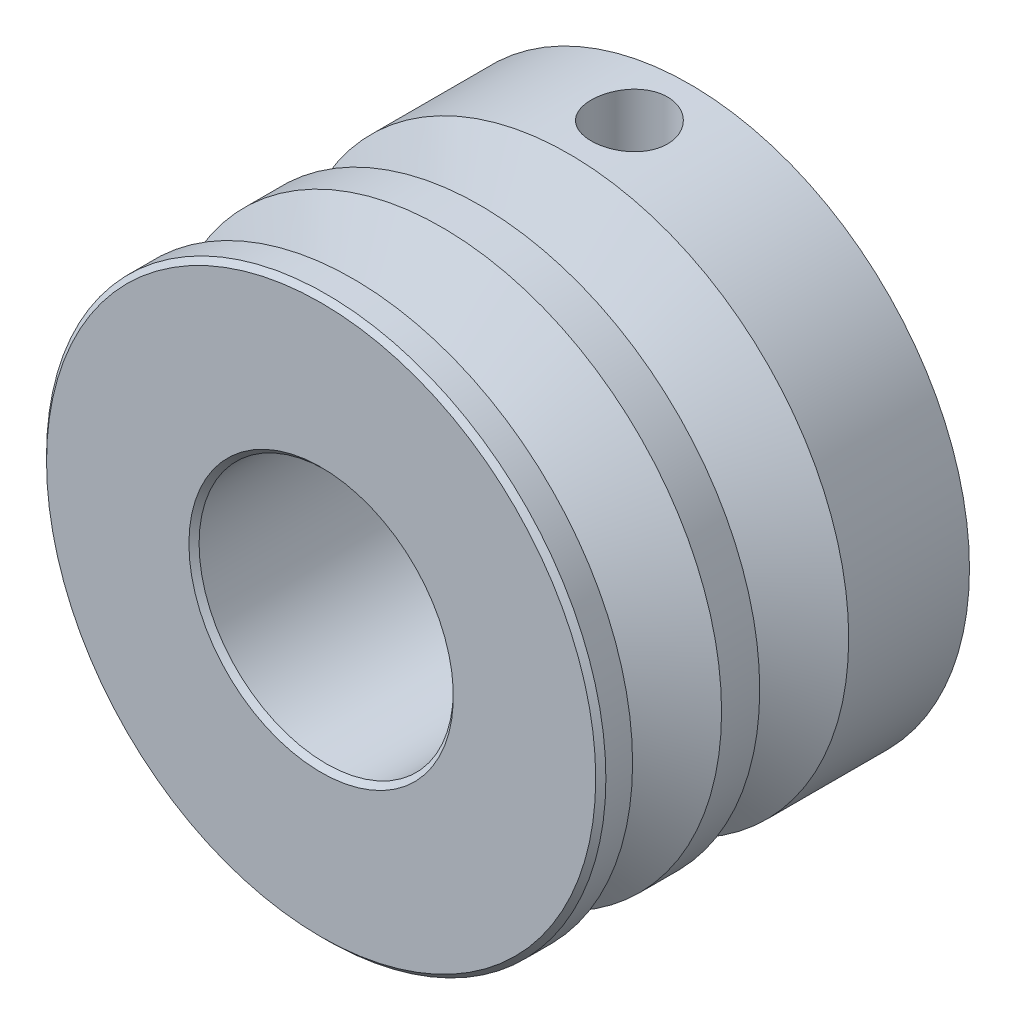
ISO-10303-21;
HEADER;
FILE_DESCRIPTION(('STEP AP214'),'2;1');
FILE_NAME('part.step','',(''),(''),'','','');
FILE_SCHEMA(('AUTOMOTIVE_DESIGN { 1 0 10303 214 1 1 1 1 }'));
ENDSEC;
DATA;
#1=APPLICATION_CONTEXT('core data for automotive mechanical design processes');
#2=APPLICATION_PROTOCOL_DEFINITION('international standard','automotive_design',2000,#1);
#3=PRODUCT_CONTEXT('',#1,'mechanical');
#4=PRODUCT('Part','Part','',(#3));
#5=PRODUCT_RELATED_PRODUCT_CATEGORY('part','',(#4));
#6=PRODUCT_DEFINITION_FORMATION('','',#4);
#7=PRODUCT_DEFINITION_CONTEXT('part definition',#1,'design');
#8=PRODUCT_DEFINITION('design','',#6,#7);
#9=PRODUCT_DEFINITION_SHAPE('','',#8);
#10=(LENGTH_UNIT() NAMED_UNIT(*) SI_UNIT(.MILLI.,.METRE.));
#11=(NAMED_UNIT(*) PLANE_ANGLE_UNIT() SI_UNIT($,.RADIAN.));
#12=(NAMED_UNIT(*) SI_UNIT($,.STERADIAN.) SOLID_ANGLE_UNIT());
#13=UNCERTAINTY_MEASURE_WITH_UNIT(LENGTH_MEASURE(1.E-05),#10,'distance_accuracy_value','');
#14=(GEOMETRIC_REPRESENTATION_CONTEXT(3) GLOBAL_UNCERTAINTY_ASSIGNED_CONTEXT((#13)) GLOBAL_UNIT_ASSIGNED_CONTEXT((#10,
#11,#12)) REPRESENTATION_CONTEXT('',''));
#15=CARTESIAN_POINT('',(0.,0.,0.));
#16=DIRECTION('',(0.,0.,1.));
#17=DIRECTION('',(1.,0.,0.));
#18=AXIS2_PLACEMENT_3D('',#15,#16,#17);
#19=CARTESIAN_POINT('',(0.,11.,0.));
#20=DIRECTION('',(0.,0.,-1.));
#21=DIRECTION('',(-1.,0.,0.));
#22=AXIS2_PLACEMENT_3D('',#19,#20,#21);
#23=PLANE('',#22);
#24=CARTESIAN_POINT('',(0.,0.,0.));
#25=DIRECTION('',(0.,0.,-1.));
#26=DIRECTION('',(-1.,0.,0.));
#27=AXIS2_PLACEMENT_3D('',#24,#25,#26);
#28=CIRCLE('',#27,10.8);
#29=CARTESIAN_POINT('',(-10.8,0.,0.));
#30=VERTEX_POINT('',#29);
#31=EDGE_CURVE('E58',#30,#30,#28,.F.);
#32=ORIENTED_EDGE('',*,*,#31,.T.);
#33=EDGE_LOOP('',(#32));
#34=FACE_BOUND('',#33,.T.);
#35=CARTESIAN_POINT('',(0.,0.,0.));
#36=DIRECTION('',(0.,0.,-1.));
#37=DIRECTION('',(-1.,0.,0.));
#38=AXIS2_PLACEMENT_3D('',#35,#36,#37);
#39=CIRCLE('',#38,5.2);
#40=CARTESIAN_POINT('',(-5.2,0.,0.));
#41=VERTEX_POINT('',#40);
#42=EDGE_CURVE('E61',#41,#41,#39,.T.);
#43=ORIENTED_EDGE('',*,*,#42,.T.);
#44=EDGE_LOOP('',(#43));
#45=FACE_BOUND('',#44,.T.);
#46=ADVANCED_FACE('F32',(#34,#45),#23,.F.);
#47=CARTESIAN_POINT('',(0.,0.,0.));
#48=DIRECTION('',(0.,0.,1.));
#49=DIRECTION('',(1.,0.,0.));
#50=AXIS2_PLACEMENT_3D('',#47,#48,#49);
#51=CYLINDRICAL_SURFACE('',#50,11.);
#52=CARTESIAN_POINT('',(0.,0.,-0.200000000000004));
#53=DIRECTION('',(0.,0.,-1.));
#54=DIRECTION('',(-1.,0.,0.));
#55=AXIS2_PLACEMENT_3D('',#52,#53,#54);
#56=CIRCLE('',#55,11.);
#57=CARTESIAN_POINT('',(-11.,0.,-0.200000000000004));
#58=VERTEX_POINT('',#57);
#59=EDGE_CURVE('E55',#58,#58,#56,.T.);
#60=ORIENTED_EDGE('',*,*,#59,.T.);
#61=EDGE_LOOP('',(#60));
#62=FACE_BOUND('',#61,.T.);
#63=CARTESIAN_POINT('',(0.,0.,-1.25));
#64=DIRECTION('',(0.,0.,1.));
#65=DIRECTION('',(1.,0.,0.));
#66=AXIS2_PLACEMENT_3D('',#63,#64,#65);
#67=CIRCLE('',#66,11.);
#68=CARTESIAN_POINT('',(11.,0.,-1.25));
#69=VERTEX_POINT('',#68);
#70=EDGE_CURVE('E186',#69,#69,#67,.T.);
#71=ORIENTED_EDGE('',*,*,#70,.T.);
#72=EDGE_LOOP('',(#71));
#73=FACE_BOUND('',#72,.T.);
#74=ADVANCED_FACE('F125',(#62,#73),#51,.T.);
#75=CARTESIAN_POINT('',(0.,0.,-2.91339745962156));
#76=DIRECTION('',(0.,0.,1.));
#77=DIRECTION('',(1.,0.,0.));
#78=AXIS2_PLACEMENT_3D('',#75,#76,#77);
#79=CONICAL_SURFACE('',#78,8.11891108675445,1.0471975511966);
#80=ORIENTED_EDGE('',*,*,#70,.F.);
#81=EDGE_LOOP('',(#80));
#82=FACE_BOUND('',#81,.T.);
#83=CARTESIAN_POINT('',(0.,0.,-2.91339745962156));
#84=DIRECTION('',(0.,0.,1.));
#85=DIRECTION('',(1.,0.,0.));
#86=AXIS2_PLACEMENT_3D('',#83,#84,#85);
#87=CIRCLE('',#86,8.11891108675445);
#88=CARTESIAN_POINT('',(8.11891108675445,0.,-2.91339745962156));
#89=VERTEX_POINT('',#88);
#90=EDGE_CURVE('E184',#89,#89,#87,.T.);
#91=ORIENTED_EDGE('',*,*,#90,.T.);
#92=EDGE_LOOP('',(#91));
#93=FACE_BOUND('',#92,.T.);
#94=ADVANCED_FACE('F131',(#82,#93),#79,.T.);
#95=CARTESIAN_POINT('',(0.,0.,-3.00000000000001));
#96=DIRECTION('',(0.,0.,1.));
#97=DIRECTION('',(1.,0.,0.));
#98=AXIS2_PLACEMENT_3D('',#95,#96,#97);
#99=TOROIDAL_SURFACE('',#98,8.16891108675445,0.0999999999999997);
#100=ORIENTED_EDGE('',*,*,#90,.F.);
#101=EDGE_LOOP('',(#100));
#102=FACE_BOUND('',#101,.T.);
#103=CARTESIAN_POINT('',(0.,0.,-3.08660254037845));
#104=DIRECTION('',(0.,0.,1.));
#105=DIRECTION('',(1.,0.,0.));
#106=AXIS2_PLACEMENT_3D('',#103,#104,#105);
#107=CIRCLE('',#106,8.11891108675445);
#108=CARTESIAN_POINT('',(8.11891108675445,0.,-3.08660254037845));
#109=VERTEX_POINT('',#108);
#110=EDGE_CURVE('E181',#109,#109,#107,.T.);
#111=ORIENTED_EDGE('',*,*,#110,.T.);
#112=EDGE_LOOP('',(#111));
#113=FACE_BOUND('',#112,.T.);
#114=ADVANCED_FACE('F319',(#102,#113),#99,.F.);
#115=CARTESIAN_POINT('',(0.,0.,-4.75));
#116=DIRECTION('',(0.,0.,-1.));
#117=DIRECTION('',(-1.,0.,0.));
#118=AXIS2_PLACEMENT_3D('',#115,#116,#117);
#119=CONICAL_SURFACE('',#118,11.,1.0471975511966);
#120=ORIENTED_EDGE('',*,*,#110,.F.);
#121=EDGE_LOOP('',(#120));
#122=FACE_BOUND('',#121,.T.);
#123=CARTESIAN_POINT('',(0.,0.,-4.75));
#124=DIRECTION('',(0.,0.,1.));
#125=DIRECTION('',(1.,0.,0.));
#126=AXIS2_PLACEMENT_3D('',#123,#124,#125);
#127=CIRCLE('',#126,11.);
#128=CARTESIAN_POINT('',(11.,0.,-4.75));
#129=VERTEX_POINT('',#128);
#130=EDGE_CURVE('E178',#129,#129,#127,.T.);
#131=ORIENTED_EDGE('',*,*,#130,.T.);
#132=EDGE_LOOP('',(#131));
#133=FACE_BOUND('',#132,.T.);
#134=ADVANCED_FACE('F309',(#122,#133),#119,.T.);
#135=CARTESIAN_POINT('',(0.,0.,0.));
#136=DIRECTION('',(0.,0.,1.));
#137=DIRECTION('',(1.,0.,0.));
#138=AXIS2_PLACEMENT_3D('',#135,#136,#137);
#139=CYLINDRICAL_SURFACE('',#138,11.);
#140=ORIENTED_EDGE('',*,*,#130,.F.);
#141=EDGE_LOOP('',(#140));
#142=FACE_BOUND('',#141,.T.);
#143=CARTESIAN_POINT('',(0.,0.,-6.25));
#144=DIRECTION('',(0.,0.,1.));
#145=DIRECTION('',(1.,0.,0.));
#146=AXIS2_PLACEMENT_3D('',#143,#144,#145);
#147=CIRCLE('',#146,11.);
#148=CARTESIAN_POINT('',(11.,0.,-6.25));
#149=VERTEX_POINT('',#148);
#150=EDGE_CURVE('E175',#149,#149,#147,.T.);
#151=ORIENTED_EDGE('',*,*,#150,.T.);
#152=EDGE_LOOP('',(#151));
#153=FACE_BOUND('',#152,.T.);
#154=ADVANCED_FACE('F299',(#142,#153),#139,.T.);
#155=CARTESIAN_POINT('',(0.,0.,-7.91339745962156));
#156=DIRECTION('',(0.,0.,1.));
#157=DIRECTION('',(1.,0.,0.));
#158=AXIS2_PLACEMENT_3D('',#155,#156,#157);
#159=CONICAL_SURFACE('',#158,8.11891108675446,1.0471975511966);
#160=ORIENTED_EDGE('',*,*,#150,.F.);
#161=EDGE_LOOP('',(#160));
#162=FACE_BOUND('',#161,.T.);
#163=CARTESIAN_POINT('',(0.,0.,-7.91339745962156));
#164=DIRECTION('',(0.,0.,1.));
#165=DIRECTION('',(1.,0.,0.));
#166=AXIS2_PLACEMENT_3D('',#163,#164,#165);
#167=CIRCLE('',#166,8.11891108675446);
#168=CARTESIAN_POINT('',(8.11891108675446,0.,-7.91339745962156));
#169=VERTEX_POINT('',#168);
#170=EDGE_CURVE('E172',#169,#169,#167,.T.);
#171=ORIENTED_EDGE('',*,*,#170,.T.);
#172=EDGE_LOOP('',(#171));
#173=FACE_BOUND('',#172,.T.);
#174=ADVANCED_FACE('F289',(#162,#173),#159,.T.);
#175=CARTESIAN_POINT('',(0.,0.,-8.));
#176=DIRECTION('',(0.,0.,1.));
#177=DIRECTION('',(1.,0.,0.));
#178=AXIS2_PLACEMENT_3D('',#175,#176,#177);
#179=TOROIDAL_SURFACE('',#178,8.16891108675446,0.0999999999999981);
#180=ORIENTED_EDGE('',*,*,#170,.F.);
#181=EDGE_LOOP('',(#180));
#182=FACE_BOUND('',#181,.T.);
#183=CARTESIAN_POINT('',(0.,0.,-8.08660254037844));
#184=DIRECTION('',(0.,0.,1.));
#185=DIRECTION('',(1.,0.,0.));
#186=AXIS2_PLACEMENT_3D('',#183,#184,#185);
#187=CIRCLE('',#186,8.11891108675446);
#188=CARTESIAN_POINT('',(8.11891108675446,0.,-8.08660254037844));
#189=VERTEX_POINT('',#188);
#190=EDGE_CURVE('E169',#189,#189,#187,.T.);
#191=ORIENTED_EDGE('',*,*,#190,.T.);
#192=EDGE_LOOP('',(#191));
#193=FACE_BOUND('',#192,.T.);
#194=ADVANCED_FACE('F280',(#182,#193),#179,.F.);
#195=CARTESIAN_POINT('',(0.,0.,-9.75));
#196=DIRECTION('',(0.,0.,-1.));
#197=DIRECTION('',(-1.,0.,0.));
#198=AXIS2_PLACEMENT_3D('',#195,#196,#197);
#199=CONICAL_SURFACE('',#198,11.,1.0471975511966);
#200=ORIENTED_EDGE('',*,*,#190,.F.);
#201=EDGE_LOOP('',(#200));
#202=FACE_BOUND('',#201,.T.);
#203=CARTESIAN_POINT('',(0.,0.,-9.75));
#204=DIRECTION('',(0.,0.,1.));
#205=DIRECTION('',(1.,0.,0.));
#206=AXIS2_PLACEMENT_3D('',#203,#204,#205);
#207=CIRCLE('',#206,11.);
#208=CARTESIAN_POINT('',(11.,0.,-9.75));
#209=VERTEX_POINT('',#208);
#210=EDGE_CURVE('E164',#209,#209,#207,.T.);
#211=ORIENTED_EDGE('',*,*,#210,.T.);
#212=EDGE_LOOP('',(#211));
#213=FACE_BOUND('',#212,.T.);
#214=ADVANCED_FACE('F120',(#202,#213),#199,.T.);
#215=CARTESIAN_POINT('',(0.,0.,0.));
#216=DIRECTION('',(0.,0.,1.));
#217=DIRECTION('',(1.,0.,0.));
#218=AXIS2_PLACEMENT_3D('',#215,#216,#217);
#219=CYLINDRICAL_SURFACE('',#218,11.);
#220=CARTESIAN_POINT('',(-10.1872930440884,-4.14958557374924,-12.125));
#221=CARTESIAN_POINT('',(-10.1872924063143,-4.14958927355221,-12.0411656721093));
#222=CARTESIAN_POINT('',(-10.1846139494418,-4.15618166788674,-11.9572805572325));
#223=CARTESIAN_POINT('',(-10.173902136692,-4.18233275765829,-11.7918495253154));
#224=CARTESIAN_POINT('',(-10.1658633462332,-4.20190461222854,-11.7103060699751));
#225=CARTESIAN_POINT('',(-10.144465675881,-4.25330295590813,-11.5519772144858));
#226=CARTESIAN_POINT('',(-10.1311106104046,-4.28512065810401,-11.475188448405));
#227=CARTESIAN_POINT('',(-10.0991519899225,-4.35990537570059,-11.3284580312526));
#228=CARTESIAN_POINT('',(-10.0805492562889,-4.40287064618466,-11.2585153109347));
#229=CARTESIAN_POINT('',(-10.0381006908613,-4.4988103358803,-11.1269854050149));
#230=CARTESIAN_POINT('',(-10.0142244148774,-4.55184261130036,-11.0654502396641));
#231=CARTESIAN_POINT('',(-9.96153086806227,-4.6660313778769,-10.9529321943143));
#232=CARTESIAN_POINT('',(-9.93271334061782,-4.72718829093171,-10.9019498626576));
#233=CARTESIAN_POINT('',(-9.87040295699463,-4.85595236964055,-10.8117955951033));
#234=CARTESIAN_POINT('',(-9.83689207644456,-4.9235840682428,-10.7726711234281));
#235=CARTESIAN_POINT('',(-9.76587555737187,-5.06298196301673,-10.7076474318913));
#236=CARTESIAN_POINT('',(-9.72837009425263,-5.1347479775858,-10.6817476316194));
#237=CARTESIAN_POINT('',(-9.65043200710311,-5.27976254479022,-10.644064968034));
#238=CARTESIAN_POINT('',(-9.61001903987051,-5.35299910034509,-10.6321953041486));
#239=CARTESIAN_POINT('',(-9.52710461109783,-5.49921258058737,-10.6226406190359));
#240=CARTESIAN_POINT('',(-9.48460324650909,-5.57218951715891,-10.6249549399504));
#241=CARTESIAN_POINT('',(-9.39904506935259,-5.71531802657846,-10.6436334275864));
#242=CARTESIAN_POINT('',(-9.35599381658322,-5.78548513859694,-10.6599042295159));
#243=CARTESIAN_POINT('',(-9.270432287083,-5.92161743230781,-10.7058876010157));
#244=CARTESIAN_POINT('',(-9.22792202227474,-5.98758252152157,-10.7356004663042));
#245=CARTESIAN_POINT('',(-9.14476597668531,-6.11383622961715,-10.8077222024899));
#246=CARTESIAN_POINT('',(-9.10412653002809,-6.17410620112709,-10.8501710007936));
#247=CARTESIAN_POINT('',(-9.02633611874861,-6.28728714571441,-10.946530549453));
#248=CARTESIAN_POINT('',(-8.98918534448628,-6.34019771730072,-11.0004419247426));
#249=CARTESIAN_POINT('',(-8.91951746093717,-6.43784455019363,-11.1187180059203));
#250=CARTESIAN_POINT('',(-8.88704048627987,-6.48251084439923,-11.183164147509));
#251=CARTESIAN_POINT('',(-8.82841873503632,-6.5621242437776,-11.3204019593368));
#252=CARTESIAN_POINT('',(-8.80227398573086,-6.59707130707761,-11.3931936655287));
#253=CARTESIAN_POINT('',(-8.75743504365044,-6.65647987031888,-11.545133450801));
#254=CARTESIAN_POINT('',(-8.73874506924998,-6.68093543410797,-11.6242850983843));
#255=CARTESIAN_POINT('',(-8.70968595146963,-6.71877556754321,-11.7866570305724));
#256=CARTESIAN_POINT('',(-8.69931632768118,-6.73216077638173,-11.8698770799775));
#257=CARTESIAN_POINT('',(-8.68743012230503,-6.74749232987587,-12.0373088435069));
#258=CARTESIAN_POINT('',(-8.6858432058719,-6.74952955382982,-12.1215072516195));
#259=CARTESIAN_POINT('',(-8.69140750681531,-6.74236274058144,-12.2891314179332));
#260=CARTESIAN_POINT('',(-8.69855850148493,-6.73315898988269,-12.372557195772));
#261=CARTESIAN_POINT('',(-8.72121913970183,-6.70378065325772,-12.5359217325789));
#262=CARTESIAN_POINT('',(-8.7366946721512,-6.68365083558017,-12.6158732927462));
#263=CARTESIAN_POINT('',(-8.77528756204159,-6.63289820077761,-12.7704217246297));
#264=CARTESIAN_POINT('',(-8.79840523572655,-6.60227494941572,-12.8450183745958));
#265=CARTESIAN_POINT('',(-8.85145292992859,-6.53098461233909,-12.9872526062227));
#266=CARTESIAN_POINT('',(-8.88142467718762,-6.49025587096775,-13.0548437161264));
#267=CARTESIAN_POINT('',(-8.94685526414777,-6.39975709787257,-13.1806725024343));
#268=CARTESIAN_POINT('',(-8.98231435885005,-6.34998664595495,-13.2389097439009));
#269=CARTESIAN_POINT('',(-9.05757909207847,-6.24216346295103,-13.3447815268094));
#270=CARTESIAN_POINT('',(-9.09741275342395,-6.1840565052151,-13.3923409644625));
#271=CARTESIAN_POINT('',(-9.17971403120402,-6.06121345919488,-13.4749858890388));
#272=CARTESIAN_POINT('',(-9.22218158607638,-5.99647752582723,-13.510071667381));
#273=CARTESIAN_POINT('',(-9.30809086981875,-5.86223247176827,-13.5666510259285));
#274=CARTESIAN_POINT('',(-9.35152911606287,-5.79273899805192,-13.5881869936464));
#275=CARTESIAN_POINT('',(-9.43805429761706,-5.65066762503095,-13.6171930076761));
#276=CARTESIAN_POINT('',(-9.48114125181401,-5.57808989286934,-13.6246638152196));
#277=CARTESIAN_POINT('',(-9.5652997196082,-5.43249986299282,-13.6253113327712));
#278=CARTESIAN_POINT('',(-9.60638474268316,-5.3594958609591,-13.6186034568827));
#279=CARTESIAN_POINT('',(-9.68580702717041,-5.21459212408636,-13.5913297343614));
#280=CARTESIAN_POINT('',(-9.72414429321923,-5.14269238738417,-13.570763911113));
#281=CARTESIAN_POINT('',(-9.79717027584927,-5.00217219975876,-13.5163964072043));
#282=CARTESIAN_POINT('',(-9.83186080282362,-4.93355013098545,-13.4826013338351));
#283=CARTESIAN_POINT('',(-9.89696212817462,-4.80162042532497,-13.4027466977595));
#284=CARTESIAN_POINT('',(-9.92737283695578,-4.73831289970586,-13.3566868783562));
#285=CARTESIAN_POINT('',(-9.98368297571917,-4.61849514584561,-13.2531872132776));
#286=CARTESIAN_POINT('',(-10.0095455201091,-4.56204154993856,-13.1956617320395));
#287=CARTESIAN_POINT('',(-10.05618020155,-4.45830496600971,-13.0710431220091));
#288=CARTESIAN_POINT('',(-10.0769511372455,-4.41102414283375,-13.0039477411135));
#289=CARTESIAN_POINT('',(-10.1133077329706,-4.32702179775105,-12.8617351533139));
#290=CARTESIAN_POINT('',(-10.1288690928126,-4.29034986628278,-12.7865824541713));
#291=CARTESIAN_POINT('',(-10.1545696136845,-4.22916386844127,-12.6306762076501));
#292=CARTESIAN_POINT('',(-10.1647145563592,-4.20463684027498,-12.5499287367712));
#293=CARTESIAN_POINT('',(-10.177186415269,-4.17433157931287,-12.4114886017611));
#294=CARTESIAN_POINT('',(-10.1809750825459,-4.16506800676166,-12.3546617888032));
#295=CARTESIAN_POINT('',(-10.1860286038796,-4.15269376229378,-12.2402313114377));
#296=CARTESIAN_POINT('',(-10.1872934824939,-4.14958303050743,-12.1826276545947));
#297=CARTESIAN_POINT('',(-10.1872930440884,-4.14958557374924,-12.125));
#298=B_SPLINE_CURVE_WITH_KNOTS('',3,(#220,#221,#222,#223,#224,#225,#226,#227,#228,#229,#230,
#231,#232,#233,#234,#235,#236,#237,#238,#239,#240,#241,#242,#243,#244,#245,#246,#247,#248,#249,
#250,#251,#252,#253,#254,#255,#256,#257,#258,#259,#260,#261,#262,#263,#264,#265,#266,#267,#268,
#269,#270,#271,#272,#273,#274,#275,#276,#277,#278,#279,#280,#281,#282,#283,#284,#285,#286,#287,
#288,#289,#290,#291,#292,#293,#294,#295,#296,#297),.UNSPECIFIED.,.T.,.F.,(4,2,2,2,2,2,2,2,2,2,2,
2,2,2,2,2,2,2,2,2,2,2,2,2,2,2,2,2,2,2,2,2,2,2,2,2,2,2,4),(0.,0.25129241365235,0.502839988614743,
0.75420740305446,1.00553549494109,1.25835430174808,1.51118624213232,1.76501723524538,
2.01883708715132,2.27107826705025,2.52330774799943,2.77386293073415,3.02442362581394,
3.27577819064357,3.52714646271319,3.78055871311718,4.0339720552646,4.28752859167033,
4.54107048692648,4.79257896376818,5.04408103043813,5.29456029222844,5.54504992054628,
5.79710712919644,6.0491760546538,6.30296596167163,6.55674993906899,6.80973601099931,
7.06270839047516,7.31362951480919,7.56455021573108,7.81534575497384,8.06614654369502,
8.31889590223288,8.57170483921668,8.82567709259412,9.07937770366508,9.25211760261265,
9.42485582072179),.UNSPECIFIED.);
#299=CARTESIAN_POINT('',(-10.1872930440884,-4.14958557374924,-12.125));
#300=VERTEX_POINT('',#299);
#301=EDGE_CURVE('E65',#300,#300,#298,.T.);
#302=ORIENTED_EDGE('',*,*,#301,.T.);
#303=EDGE_LOOP('',(#302));
#304=FACE_BOUND('',#303,.T.);
#305=CARTESIAN_POINT('',(0.,11.,-13.625));
#306=CARTESIAN_POINT('',(0.0838384134298601,10.9999987467262,-13.6249964805426));
#307=CARTESIAN_POINT('',(0.167727602289745,10.9990314271488,-13.6179474073274));
#308=CARTESIAN_POINT('',(0.33316709764141,10.9952656640845,-13.5899411167757));
#309=CARTESIAN_POINT('',(0.414714945659854,10.992465364401,-13.5689698005502));
#310=CARTESIAN_POINT('',(0.57305309369359,10.9853487739829,-13.5137522661594));
#311=CARTESIAN_POINT('',(0.649846722453222,10.9810335583919,-13.4795154607979));
#312=CARTESIAN_POINT('',(0.796585302449724,10.971365727223,-13.3987604754398));
#313=CARTESIAN_POINT('',(0.866531328858714,10.9660132749006,-13.3522442277457));
#314=CARTESIAN_POINT('',(0.998057563812241,10.9548285996925,-13.2479277857077));
#315=CARTESIAN_POINT('',(1.05958678462376,10.9489937690522,-13.1900635769965));
#316=CARTESIAN_POINT('',(1.17209333908043,10.9375227155932,-13.0648313892076));
#317=CARTESIAN_POINT('',(1.22307010612798,10.9318865034525,-12.9974629001387));
#318=CARTESIAN_POINT('',(1.31321850524922,10.9214253777188,-12.8547980617759));
#319=CARTESIAN_POINT('',(1.35234166468403,10.916603830108,-12.7794708149948));
#320=CARTESIAN_POINT('',(1.41736264485277,10.9083529406776,-12.6232381846263));
#321=CARTESIAN_POINT('',(1.44326106107984,10.904923536173,-12.5423330523902));
#322=CARTESIAN_POINT('',(1.48094090555089,10.8998704969217,-12.3777737564264));
#323=CARTESIAN_POINT('',(1.49280898864548,10.8982357822449,-12.2941397807089));
#324=CARTESIAN_POINT('',(1.50235955059666,10.8969234380482,-12.1260525269759));
#325=CARTESIAN_POINT('',(1.50004270497975,10.8972457153308,-12.0415992881672));
#326=CARTESIAN_POINT('',(1.48136017019239,10.8998008033656,-11.8748782743991));
#327=CARTESIAN_POINT('',(1.46509038917589,10.9020205710196,-11.7925995236328));
#328=CARTESIAN_POINT('',(1.41911367695299,10.9081001740818,-11.6319509594674));
#329=CARTESIAN_POINT('',(1.38940642650252,10.911960048455,-11.553581238987));
#330=CARTESIAN_POINT('',(1.31729641760207,10.920899582937,-11.4026800739624));
#331=CARTESIAN_POINT('',(1.2748524385776,10.9259831927575,-11.330168570732));
#332=CARTESIAN_POINT('',(1.1785032304482,10.9367944433469,-11.1932608511142));
#333=CARTESIAN_POINT('',(1.12459737823041,10.9425221191218,-11.1288650762333));
#334=CARTESIAN_POINT('',(1.00632527783799,10.954033973898,-11.0094604455054));
#335=CARTESIAN_POINT('',(0.941876450734222,10.9598182294108,-10.9545333596876));
#336=CARTESIAN_POINT('',(0.804630944405404,10.9707474705779,-10.8562635084016));
#337=CARTESIAN_POINT('',(0.731834239164635,10.9758924542398,-10.812920779037));
#338=CARTESIAN_POINT('',(0.579892969480446,10.9849675408771,-10.73904813682));
#339=CARTESIAN_POINT('',(0.500745632131286,10.9888971094847,-10.7085238576073));
#340=CARTESIAN_POINT('',(0.338383087939893,10.9950939520307,-10.6612221620544));
#341=CARTESIAN_POINT('',(0.255168108280129,10.997361318692,-10.6444439789065));
#342=CARTESIAN_POINT('',(0.087738907367673,10.9999661380375,-10.6252179154344));
#343=CARTESIAN_POINT('',(0.00353783638784458,11.0003187469014,-10.6226574914114));
#344=CARTESIAN_POINT('',(-0.164092294089252,10.9990953877098,-10.6316418783307));
#345=CARTESIAN_POINT('',(-0.247521373180416,10.9975194687383,-10.6431863302829));
#346=CARTESIAN_POINT('',(-0.410903378364943,10.9926255265792,-10.6799592232097));
#347=CARTESIAN_POINT('',(-0.490868720620555,10.9893144012332,-10.7051334955713));
#348=CARTESIAN_POINT('',(-0.645443141095582,10.9813204406364,-10.7683947590329));
#349=CARTESIAN_POINT('',(-0.72005200642521,10.9766375509031,-10.8064822630172));
#350=CARTESIAN_POINT('',(-0.862294892982454,10.9663836303603,-10.894757538724));
#351=CARTESIAN_POINT('',(-0.929883728353238,10.960807370571,-10.9450175028004));
#352=CARTESIAN_POINT('',(-1.0557070132546,10.9494055314268,-11.0561095779574));
#353=CARTESIAN_POINT('',(-1.11394101745331,10.9435799402192,-11.1169421920567));
#354=CARTESIAN_POINT('',(-1.21980532954112,10.9322886877303,-11.2479508330084));
#355=CARTESIAN_POINT('',(-1.26736066380641,10.9268257501214,-11.3181877134811));
#356=CARTESIAN_POINT('',(-1.34999839549264,10.9169246504416,-11.4657183076998));
#357=CARTESIAN_POINT('',(-1.38508108196141,10.9124864646235,-11.5430118578586));
#358=CARTESIAN_POINT('',(-1.44165849505152,10.9051564726067,-11.7022277566732));
#359=CARTESIAN_POINT('',(-1.46319427050012,10.902259998972,-11.7841352944361));
#360=CARTESIAN_POINT('',(-1.49219810547518,10.8983284316023,-11.950446521828));
#361=CARTESIAN_POINT('',(-1.499666954979,10.8972932333409,-12.0348500710144));
#362=CARTESIAN_POINT('',(-1.50030856584717,10.8972048541528,-12.203010975391));
#363=CARTESIAN_POINT('',(-1.49359914690636,10.8981353386205,-12.2867678966084));
#364=CARTESIAN_POINT('',(-1.46632546438533,10.9018382005365,-12.4519511386985));
#365=CARTESIAN_POINT('',(-1.44576120871188,10.9046105769335,-12.5333774609011));
#366=CARTESIAN_POINT('',(-1.39140056450479,10.9116795081979,-12.6915651393851));
#367=CARTESIAN_POINT('',(-1.3576109698069,10.9159752803929,-12.7683288674825));
#368=CARTESIAN_POINT('',(-1.27777039839119,10.925608111245,-12.9151162986064));
#369=CARTESIAN_POINT('',(-1.23171915365824,10.9309451926623,-12.9851398542605));
#370=CARTESIAN_POINT('',(-1.12822915223083,10.9421122992185,-13.1170600365998));
#371=CARTESIAN_POINT('',(-1.07070278423402,10.9479459056036,-13.1788876362225));
#372=CARTESIAN_POINT('',(-0.946079868053619,10.9594178730356,-13.2920553467108));
#373=CARTESIAN_POINT('',(-0.878981081957847,10.9650561880416,-13.3433929983114));
#374=CARTESIAN_POINT('',(-0.736765493201997,10.9755309296992,-13.4343259673834));
#375=CARTESIAN_POINT('',(-0.661613818517361,10.9803636164562,-13.4738671582763));
#376=CARTESIAN_POINT('',(-0.505709693930314,10.9886453705716,-13.539709481053));
#377=CARTESIAN_POINT('',(-0.424963312021875,10.9920959102772,-13.5660247096937));
#378=CARTESIAN_POINT('',(-0.286518597087188,10.9964117606731,-13.5985104370639));
#379=CARTESIAN_POINT('',(-0.229685788696071,10.9977506427886,-13.6084293607973));
#380=CARTESIAN_POINT('',(-0.115243313646886,10.9995451890738,-13.6216753209812));
#381=CARTESIAN_POINT('',(-0.0576336542976996,11.0000008615472,-13.6250024194063));
#382=CARTESIAN_POINT('',(0.,11.,-13.625));
#383=B_SPLINE_CURVE_WITH_KNOTS('',3,(#305,#306,#307,#308,#309,#310,#311,#312,#313,#314,#315,
#316,#317,#318,#319,#320,#321,#322,#323,#324,#325,#326,#327,#328,#329,#330,#331,#332,#333,#334,
#335,#336,#337,#338,#339,#340,#341,#342,#343,#344,#345,#346,#347,#348,#349,#350,#351,#352,#353,
#354,#355,#356,#357,#358,#359,#360,#361,#362,#363,#364,#365,#366,#367,#368,#369,#370,#371,#372,
#373,#374,#375,#376,#377,#378,#379,#380,#381,#382),.UNSPECIFIED.,.T.,.F.,(4,2,2,2,2,2,2,2,2,2,2,
2,2,2,2,2,2,2,2,2,2,2,2,2,2,2,2,2,2,2,2,2,2,2,2,2,2,2,4),(0.,0.251304688086149,
0.502864258429489,0.754245655375314,1.00558751830524,1.25839025869502,1.51120656941611,
1.76504317927171,2.01886835818388,2.27111752000616,2.5233546691019,2.77387178872722,
3.02439486038873,3.27573762185032,3.52709405079552,3.78052284746837,4.03395243396007,
4.28749328511459,4.54101999186668,4.79253696204822,5.04404753088006,5.2945657880954,
5.54509399649479,5.79714607697888,6.0492101527175,6.30299215129404,6.55676826820726,
6.80977166004948,7.06276084317856,7.31365598745056,7.56455098853988,7.81531727406237,
8.06608904128416,8.31885423544364,8.57167862009405,8.82564582024672,9.07934175494254,
9.25209960062618,9.42485582207669),.UNSPECIFIED.);
#384=CARTESIAN_POINT('',(0.,11.,-13.625));
#385=VERTEX_POINT('',#384);
#386=EDGE_CURVE('E64',#385,#385,#383,.T.);
#387=ORIENTED_EDGE('',*,*,#386,.T.);
#388=EDGE_LOOP('',(#387));
#389=FACE_BOUND('',#388,.T.);
#390=ORIENTED_EDGE('',*,*,#210,.F.);
#391=EDGE_LOOP('',(#390));
#392=FACE_BOUND('',#391,.T.);
#393=CARTESIAN_POINT('',(0.,0.,-14.5));
#394=DIRECTION('',(0.,0.,1.));
#395=DIRECTION('',(1.,0.,0.));
#396=AXIS2_PLACEMENT_3D('',#393,#394,#395);
#397=CIRCLE('',#396,11.);
#398=CARTESIAN_POINT('',(11.,0.,-14.5));
#399=VERTEX_POINT('',#398);
#400=EDGE_CURVE('E161',#399,#399,#397,.T.);
#401=ORIENTED_EDGE('',*,*,#400,.T.);
#402=EDGE_LOOP('',(#401));
#403=FACE_BOUND('',#402,.T.);
#404=ADVANCED_FACE('F79',(#304,#389,#392,#403),#219,.T.);
#405=CARTESIAN_POINT('',(0.,11.,-14.5));
#406=DIRECTION('',(0.,0.,1.));
#407=DIRECTION('',(1.,0.,0.));
#408=AXIS2_PLACEMENT_3D('',#405,#406,#407);
#409=PLANE('',#408);
#410=ORIENTED_EDGE('',*,*,#400,.F.);
#411=EDGE_LOOP('',(#410));
#412=FACE_BOUND('',#411,.T.);
#413=CARTESIAN_POINT('',(0.,0.,-14.5));
#414=DIRECTION('',(0.,0.,1.));
#415=DIRECTION('',(1.,0.,0.));
#416=AXIS2_PLACEMENT_3D('',#413,#414,#415);
#417=CIRCLE('',#416,6.);
#418=CARTESIAN_POINT('',(6.,0.,-14.5));
#419=VERTEX_POINT('',#418);
#420=EDGE_CURVE('E159',#419,#419,#417,.T.);
#421=ORIENTED_EDGE('',*,*,#420,.T.);
#422=EDGE_LOOP('',(#421));
#423=FACE_BOUND('',#422,.T.);
#424=ADVANCED_FACE('F114',(#412,#423),#409,.F.);
#425=CARTESIAN_POINT('',(0.,0.,0.));
#426=DIRECTION('',(0.,0.,1.));
#427=DIRECTION('',(1.,0.,0.));
#428=AXIS2_PLACEMENT_3D('',#425,#426,#427);
#429=CYLINDRICAL_SURFACE('',#428,6.);
#430=CARTESIAN_POINT('',(0.,0.,-14.8));
#431=DIRECTION('',(0.,0.,1.));
#432=DIRECTION('',(1.,0.,0.));
#433=AXIS2_PLACEMENT_3D('',#430,#431,#432);
#434=CIRCLE('',#433,6.);
#435=CARTESIAN_POINT('',(6.,0.,-14.8));
#436=VERTEX_POINT('',#435);
#437=EDGE_CURVE('E10',#436,#436,#434,.T.);
#438=ORIENTED_EDGE('',*,*,#437,.T.);
#439=EDGE_LOOP('',(#438));
#440=FACE_BOUND('',#439,.T.);
#441=ORIENTED_EDGE('',*,*,#420,.F.);
#442=EDGE_LOOP('',(#441));
#443=FACE_BOUND('',#442,.T.);
#444=ADVANCED_FACE('F112',(#440,#443),#429,.T.);
#445=CARTESIAN_POINT('',(0.,6.,-15.));
#446=DIRECTION('',(0.,0.,1.));
#447=DIRECTION('',(1.,0.,0.));
#448=AXIS2_PLACEMENT_3D('',#445,#446,#447);
#449=PLANE('',#448);
#450=CARTESIAN_POINT('',(0.,0.,-15.));
#451=DIRECTION('',(0.,0.,1.));
#452=DIRECTION('',(1.,0.,0.));
#453=AXIS2_PLACEMENT_3D('',#450,#451,#452);
#454=CIRCLE('',#453,5.2);
#455=CARTESIAN_POINT('',(5.2,0.,-15.));
#456=VERTEX_POINT('',#455);
#457=EDGE_CURVE('E39',#456,#456,#454,.T.);
#458=ORIENTED_EDGE('',*,*,#457,.T.);
#459=EDGE_LOOP('',(#458));
#460=FACE_BOUND('',#459,.T.);
#461=CARTESIAN_POINT('',(0.,0.,-15.));
#462=DIRECTION('',(0.,0.,1.));
#463=DIRECTION('',(1.,0.,0.));
#464=AXIS2_PLACEMENT_3D('',#461,#462,#463);
#465=CIRCLE('',#464,5.8);
#466=CARTESIAN_POINT('',(5.8,0.,-15.));
#467=VERTEX_POINT('',#466);
#468=EDGE_CURVE('E43',#467,#467,#465,.F.);
#469=ORIENTED_EDGE('',*,*,#468,.T.);
#470=EDGE_LOOP('',(#469));
#471=FACE_BOUND('',#470,.T.);
#472=ADVANCED_FACE('F107',(#460,#471),#449,.F.);
#473=CARTESIAN_POINT('',(0.,0.,0.));
#474=DIRECTION('',(0.,0.,1.));
#475=DIRECTION('',(1.,0.,0.));
#476=AXIS2_PLACEMENT_3D('',#473,#474,#475);
#477=CYLINDRICAL_SURFACE('',#476,5.);
#478=CARTESIAN_POINT('',(0.,0.,-0.200000000000007));
#479=DIRECTION('',(0.,0.,-1.));
#480=DIRECTION('',(-1.,0.,0.));
#481=AXIS2_PLACEMENT_3D('',#478,#479,#480);
#482=CIRCLE('',#481,5.);
#483=CARTESIAN_POINT('',(-5.,0.,-0.200000000000007));
#484=VERTEX_POINT('',#483);
#485=EDGE_CURVE('E47',#484,#484,#482,.F.);
#486=ORIENTED_EDGE('',*,*,#485,.T.);
#487=EDGE_LOOP('',(#486));
#488=FACE_BOUND('',#487,.T.);
#489=CARTESIAN_POINT('',(0.,0.,-14.8));
#490=DIRECTION('',(0.,0.,1.));
#491=DIRECTION('',(1.,0.,0.));
#492=AXIS2_PLACEMENT_3D('',#489,#490,#491);
#493=CIRCLE('',#492,5.);
#494=CARTESIAN_POINT('',(5.,0.,-14.8));
#495=VERTEX_POINT('',#494);
#496=EDGE_CURVE('E52',#495,#495,#493,.F.);
#497=ORIENTED_EDGE('',*,*,#496,.T.);
#498=EDGE_LOOP('',(#497));
#499=FACE_BOUND('',#498,.T.);
#500=CARTESIAN_POINT('',(-4.88067791046457,-1.08580989786574,-12.125));
#501=CARTESIAN_POINT('',(-4.88067813491526,-1.08581120947588,-12.2071945479424));
#502=CARTESIAN_POINT('',(-4.8791485829401,-1.09275456085145,-12.289399224144));
#503=CARTESIAN_POINT('',(-4.87292422463798,-1.12017922755185,-12.4514052495919));
#504=CARTESIAN_POINT('',(-4.86822836070084,-1.14066506628777,-12.5312057865015));
#505=CARTESIAN_POINT('',(-4.85538400185811,-1.19415026823733,-12.6860347282717));
#506=CARTESIAN_POINT('',(-4.84724124715071,-1.22712881745611,-12.7610708296331));
#507=CARTESIAN_POINT('',(-4.82707330846062,-1.30420242883797,-12.9046219339953));
#508=CARTESIAN_POINT('',(-4.81504754321068,-1.3482991551198,-12.9731359586844));
#509=CARTESIAN_POINT('',(-4.78621447984503,-1.44737058870189,-13.1038663905774));
#510=CARTESIAN_POINT('',(-4.76927996768532,-1.50262094668129,-13.1658458979463));
#511=CARTESIAN_POINT('',(-4.73028348330784,-1.62120591144208,-13.2796379513225));
#512=CARTESIAN_POINT('',(-4.70822085279194,-1.6845415556632,-13.3314491904499));
#513=CARTESIAN_POINT('',(-4.65810693649858,-1.81858641048322,-13.4244626998333));
#514=CARTESIAN_POINT('',(-4.62994124289656,-1.88942101809265,-13.4654234244428));
#515=CARTESIAN_POINT('',(-4.56785487952583,-2.03493198547354,-13.5339872590427));
#516=CARTESIAN_POINT('',(-4.53393545306119,-2.10960751285012,-13.5615932498574));
#517=CARTESIAN_POINT('',(-4.46179298374456,-2.25810077937187,-13.6018800010905));
#518=CARTESIAN_POINT('',(-4.42372080889375,-2.3318819478831,-13.6149651276527));
#519=CARTESIAN_POINT('',(-4.34338527185408,-2.47830006232932,-13.6271173246464));
#520=CARTESIAN_POINT('',(-4.30112279182659,-2.55093724538544,-13.626187339402));
#521=CARTESIAN_POINT('',(-4.21511410034611,-2.69060029485373,-13.610607131457));
#522=CARTESIAN_POINT('',(-4.17145800698346,-2.75773119436985,-13.5963948061901));
#523=CARTESIAN_POINT('',(-4.08294207330507,-2.88716732692687,-13.5553686640057));
#524=CARTESIAN_POINT('',(-4.03808215692776,-2.94947225407551,-13.5285540490573));
#525=CARTESIAN_POINT('',(-3.94831499208437,-3.06862224916322,-13.4627879765814));
#526=CARTESIAN_POINT('',(-3.90341327783858,-3.12539527337872,-13.4236987971927));
#527=CARTESIAN_POINT('',(-3.81589255035073,-3.23167303953033,-13.3346021475718));
#528=CARTESIAN_POINT('',(-3.77327408165899,-3.28117605243938,-13.2845920870365));
#529=CARTESIAN_POINT('',(-3.69057183607628,-3.37397308069643,-13.1728022492484));
#530=CARTESIAN_POINT('',(-3.65064909852523,-3.41695418717799,-13.1106430809703));
#531=CARTESIAN_POINT('',(-3.57721608539249,-3.4937595881975,-12.9774899821099));
#532=CARTESIAN_POINT('',(-3.54370644713514,-3.52758297279293,-12.9064951746108));
#533=CARTESIAN_POINT('',(-3.48468687700814,-3.58590334450693,-12.756760530751));
#534=CARTESIAN_POINT('',(-3.45925673694342,-3.61030778910819,-12.6779529541371));
#535=CARTESIAN_POINT('',(-3.41848350126949,-3.64894074193401,-12.5153927915545));
#536=CARTESIAN_POINT('',(-3.40313711508608,-3.66317256986412,-12.4316418284654));
#537=CARTESIAN_POINT('',(-3.38397534830384,-3.68087975600198,-12.2649176392607));
#538=CARTESIAN_POINT('',(-3.37975149613132,-3.68473626515243,-12.182031776106));
#539=CARTESIAN_POINT('',(-3.38194497181719,-3.682723329249,-12.0165270999901));
#540=CARTESIAN_POINT('',(-3.3883608101096,-3.6768552456467,-11.9339082512692));
#541=CARTESIAN_POINT('',(-3.41108351949154,-3.65578120647802,-11.7735116220291));
#542=CARTESIAN_POINT('',(-3.42712910467065,-3.64082179676217,-11.6956638357365));
#543=CARTESIAN_POINT('',(-3.46789552150614,-3.60201158603534,-11.5445983091851));
#544=CARTESIAN_POINT('',(-3.49261769260718,-3.57815941217184,-11.4713812858594));
#545=CARTESIAN_POINT('',(-3.55012400409715,-3.52112155219481,-11.3294825359279));
#546=CARTESIAN_POINT('',(-3.58310671652649,-3.48770253943078,-11.2609752790142));
#547=CARTESIAN_POINT('',(-3.65505070698103,-3.41223058420804,-11.1323618938192));
#548=CARTESIAN_POINT('',(-3.69401341558136,-3.3701755749721,-11.0722577823872));
#549=CARTESIAN_POINT('',(-3.77764222362338,-3.27620440683,-10.9598195941853));
#550=CARTESIAN_POINT('',(-3.82246807544343,-3.22397598428202,-10.907864371013));
#551=CARTESIAN_POINT('',(-3.91449956711778,-3.11158489851863,-10.8160332989723));
#552=CARTESIAN_POINT('',(-3.96170508865132,-3.05142262954609,-10.7761568502185));
#553=CARTESIAN_POINT('',(-4.05606033730482,-2.92481682672224,-10.7099999694317));
#554=CARTESIAN_POINT('',(-4.10320773493914,-2.8584247975751,-10.683617983841));
#555=CARTESIAN_POINT('',(-4.19586302705859,-2.7205916474713,-10.6449390811096));
#556=CARTESIAN_POINT('',(-4.24137138701442,-2.64915197733974,-10.6326381340516));
#557=CARTESIAN_POINT('',(-4.32737723063044,-2.50609365465936,-10.6227769559455));
#558=CARTESIAN_POINT('',(-4.36800019309318,-2.43458784031838,-10.6246673045922));
#559=CARTESIAN_POINT('',(-4.44503294205775,-2.29092239233935,-10.6418216324991));
#560=CARTESIAN_POINT('',(-4.48144296731229,-2.21876279600214,-10.6570848534805));
#561=CARTESIAN_POINT('',(-4.54896588229914,-2.07678333712704,-10.7002116613996));
#562=CARTESIAN_POINT('',(-4.58013145618742,-2.00694667055629,-10.727938180649));
#563=CARTESIAN_POINT('',(-4.63736689318394,-1.87090378845658,-10.7950819145072));
#564=CARTESIAN_POINT('',(-4.66343591772845,-1.80469817165167,-10.8345010502862));
#565=CARTESIAN_POINT('',(-4.71129822710207,-1.67587141761462,-10.92537345743));
#566=CARTESIAN_POINT('',(-4.7329280097888,-1.61343275695115,-10.9771714300008));
#567=CARTESIAN_POINT('',(-4.77117659437918,-1.49655047089851,-11.0907103883328));
#568=CARTESIAN_POINT('',(-4.78779394903957,-1.44210915691422,-11.1524542378982));
#569=CARTESIAN_POINT('',(-4.81692865669863,-1.34164844278987,-11.2863407783105));
#570=CARTESIAN_POINT('',(-4.8293090502158,-1.29592841344376,-11.3587385533904));
#571=CARTESIAN_POINT('',(-4.84982678381465,-1.21690455270053,-11.510555174161));
#572=CARTESIAN_POINT('',(-4.85796616335223,-1.18359475556262,-11.5899706236012));
#573=CARTESIAN_POINT('',(-4.86981614421036,-1.13378734906039,-11.7447404316063));
#574=CARTESIAN_POINT('',(-4.87390979714369,-1.11586369664982,-11.819608646931));
#575=CARTESIAN_POINT('',(-4.87934029901371,-1.09187554663328,-11.9713152224958));
#576=CARTESIAN_POINT('',(-4.88067770061707,-1.08580867159143,-12.0481531846452));
#577=CARTESIAN_POINT('',(-4.88067791046457,-1.08580989786574,-12.125));
#578=B_SPLINE_CURVE_WITH_KNOTS('',3,(#500,#501,#502,#503,#504,#505,#506,#507,#508,#509,#510,
#511,#512,#513,#514,#515,#516,#517,#518,#519,#520,#521,#522,#523,#524,#525,#526,#527,#528,#529,
#530,#531,#532,#533,#534,#535,#536,#537,#538,#539,#540,#541,#542,#543,#544,#545,#546,#547,#548,
#549,#550,#551,#552,#553,#554,#555,#556,#557,#558,#559,#560,#561,#562,#563,#564,#565,#566,#567,
#568,#569,#570,#571,#572,#573,#574,#575,#576,#577),.UNSPECIFIED.,.T.,.F.,(4,2,2,2,2,2,2,2,2,2,2,
2,2,2,2,2,2,2,2,2,2,2,2,2,2,2,2,2,2,2,2,2,2,2,2,2,2,2,4),(0.,0.246300165915544,
0.492682641688997,0.73865641446619,0.984667025370096,1.23773150007983,1.49082847871272,
1.74915939273644,2.00743455587876,2.25832140149556,2.50915554101439,2.75200125990879,
2.99486235890374,3.24055209335675,3.48630016590829,3.74152147023276,3.99676812491861,
4.25446238246264,4.51207250628409,4.76008080790307,5.00805439107385,5.24958594938814,
5.49115481045785,5.73920731809385,5.9873192592892,6.24479506100599,6.50225807324199,
6.75775391814321,7.01317662321678,7.25876303911216,7.50433553047751,7.74727096872215,
7.99024634491374,8.24099627054484,8.49181852629886,8.75011639669143,9.0082899396394,
9.23861153857443,9.46888695033555),.UNSPECIFIED.);
#579=CARTESIAN_POINT('',(-4.88067791046457,-1.08580989786574,-12.125));
#580=VERTEX_POINT('',#579);
#581=EDGE_CURVE('E73',#580,#580,#578,.T.);
#582=ORIENTED_EDGE('',*,*,#581,.T.);
#583=EDGE_LOOP('',(#582));
#584=FACE_BOUND('',#583,.T.);
#585=CARTESIAN_POINT('',(0.,5.,-13.625));
#586=CARTESIAN_POINT('',(-0.0822886127532995,4.9999992925055,-13.6249990025151));
#587=CARTESIAN_POINT('',(-0.164587318351529,4.99794915693954,-13.618206136376));
#588=CARTESIAN_POINT('',(-0.326788125304879,4.98997105593691,-13.5912786457779));
#589=CARTESIAN_POINT('',(-0.406689504411417,4.98404193389692,-13.5711400419766));
#590=CARTESIAN_POINT('',(-0.561732707754523,4.96895552501836,-13.5182539830897));
#591=CARTESIAN_POINT('',(-0.636881364395369,4.95980300250425,-13.4855251303811));
#592=CARTESIAN_POINT('',(-0.780624181053127,4.93922109237645,-13.4084639069442));
#593=CARTESIAN_POINT('',(-0.849217467469665,4.92779140192067,-13.3641299926046));
#594=CARTESIAN_POINT('',(-0.979871797183739,4.90350737192774,-13.2637759925273));
#595=CARTESIAN_POINT('',(-1.04171807124433,4.89062383657036,-13.2074833741141));
#596=CARTESIAN_POINT('',(-1.15524920923323,4.86505834210442,-13.0853907700898));
#597=CARTESIAN_POINT('',(-1.2069323632744,4.85237641724502,-13.019589187875));
#598=CARTESIAN_POINT('',(-1.29980037723707,4.82834113993772,-12.8785292469624));
#599=CARTESIAN_POINT('',(-1.34072309022213,4.81702406663875,-12.8030915390093));
#600=CARTESIAN_POINT('',(-1.4092139477476,4.79743620394031,-12.6460107457697));
#601=CARTESIAN_POINT('',(-1.43678529919972,4.78916468313311,-12.564369156072));
#602=CARTESIAN_POINT('',(-1.47701633682651,4.77690870838434,-12.3996097338695));
#603=CARTESIAN_POINT('',(-1.49007196234677,4.77281069324534,-12.3165972561361));
#604=CARTESIAN_POINT('',(-1.50213730614671,4.76902789749768,-12.1494668437832));
#605=CARTESIAN_POINT('',(-1.50115042761078,4.76934204760571,-12.0653491819409));
#606=CARTESIAN_POINT('',(-1.48546977199811,4.77424744067778,-11.9016160913915));
#607=CARTESIAN_POINT('',(-1.47127205262684,4.77868388599141,-11.8219477496378));
#608=CARTESIAN_POINT('',(-1.43037420427055,4.79108356228624,-11.6661802137265));
#609=CARTESIAN_POINT('',(-1.4036728414164,4.79904714132351,-11.5900813726257));
#610=CARTESIAN_POINT('',(-1.33816026653681,4.81772733074973,-11.4423996503393));
#611=CARTESIAN_POINT('',(-1.29918816934642,4.82848016115952,-11.3708929160447));
#612=CARTESIAN_POINT('',(-1.21035222588683,4.85150987000065,-11.2352679779898));
#613=CARTESIAN_POINT('',(-1.16048574002588,4.86378711746991,-11.1711515705862));
#614=CARTESIAN_POINT('',(-1.04881290765546,4.88911011297937,-11.049313809238));
#615=CARTESIAN_POINT('',(-0.986594907466967,4.90216654310498,-10.9919713359703));
#616=CARTESIAN_POINT('',(-0.853263259313962,4.92712244063259,-10.8884460159358));
#617=CARTESIAN_POINT('',(-0.782149051860884,4.9390218351841,-10.8422638715856));
#618=CARTESIAN_POINT('',(-0.6323550383428,4.9604316006947,-10.7621400775353));
#619=CARTESIAN_POINT('',(-0.553627749747948,4.96992543668314,-10.7282824837501));
#620=CARTESIAN_POINT('',(-0.391245415603518,4.98533521832222,-10.6744004099004));
#621=CARTESIAN_POINT('',(-0.30759175158958,4.99125216186999,-10.6543720714675));
#622=CARTESIAN_POINT('',(-0.14095224266833,4.99868364643538,-10.6293478221006));
#623=CARTESIAN_POINT('',(-0.0580500976011862,5.0003485041779,-10.6238384141984));
#624=CARTESIAN_POINT('',(0.107499605823383,4.9995292324176,-10.6265691557121));
#625=CARTESIAN_POINT('',(0.19014719669078,4.99704565677756,-10.6348074696514));
#626=CARTESIAN_POINT('',(0.350903605309695,4.98830696987163,-10.6643846111115));
#627=CARTESIAN_POINT('',(0.429072772614167,4.98213829799417,-10.6854233875809));
#628=CARTESIAN_POINT('',(0.580754638954519,4.96674347841533,-10.7396432327782));
#629=CARTESIAN_POINT('',(0.65426677702558,4.95751696321085,-10.7728257610379));
#630=CARTESIAN_POINT('',(0.796437189461048,4.93669654351325,-10.8512531654811));
#631=CARTESIAN_POINT('',(0.864943826199665,4.92505280829675,-10.896759340948));
#632=CARTESIAN_POINT('',(0.993523307980142,4.90073468764318,-10.9982247540528));
#633=CARTESIAN_POINT('',(1.05359403235593,4.8880600443108,-11.0541866118877));
#634=CARTESIAN_POINT('',(1.16585744551026,4.86253171869138,-11.1773873083694));
#635=CARTESIAN_POINT('',(1.21768481231503,4.84968825033268,-11.2449618757717));
#636=CARTESIAN_POINT('',(1.30928995072153,4.82576515238464,-11.3881279390135));
#637=CARTESIAN_POINT('',(1.34906803829471,4.81468547654651,-11.4637192245582));
#638=CARTESIAN_POINT('',(1.41517347127168,4.79567189615055,-11.6205324912547));
#639=CARTESIAN_POINT('',(1.44156346937049,4.78772337843827,-11.7017261865366));
#640=CARTESIAN_POINT('',(1.48021730815113,4.77591594362794,-11.8676879689315));
#641=CARTESIAN_POINT('',(1.49248598978778,4.77205562508301,-11.9524548207877));
#642=CARTESIAN_POINT('',(1.50221984485058,4.76899972496087,-12.1193615183762));
#643=CARTESIAN_POINT('',(1.50028055308489,4.76961647442755,-12.2014636510176));
#644=CARTESIAN_POINT('',(1.48307505444813,4.77499401288294,-12.3641141033728));
#645=CARTESIAN_POINT('',(1.46780938124715,4.77975463592551,-12.4446624851764));
#646=CARTESIAN_POINT('',(1.42476888804135,4.79275763670386,-12.6009453991428));
#647=CARTESIAN_POINT('',(1.39715175507068,4.80095604545965,-12.6767272873617));
#648=CARTESIAN_POINT('',(1.33031507121129,4.81990278909137,-12.8226424388177));
#649=CARTESIAN_POINT('',(1.29109329962876,4.83065161194312,-12.8927746176408));
#650=CARTESIAN_POINT('',(1.20048763805071,4.85397676425833,-13.0281631165271));
#651=CARTESIAN_POINT('',(1.14871276092993,4.86660540163798,-13.0931487612604));
#652=CARTESIAN_POINT('',(1.03517434629781,4.89201320450026,-13.2137024983079));
#653=CARTESIAN_POINT('',(0.973408217134495,4.90479240823905,-13.2692681394678));
#654=CARTESIAN_POINT('',(0.839465762183243,4.92950936570649,-13.371023412295));
#655=CARTESIAN_POINT('',(0.767037885790604,4.94141159765674,-13.4168914468555));
#656=CARTESIAN_POINT('',(0.615141373983526,4.96260680455813,-13.495735169904));
#657=CARTESIAN_POINT('',(0.535676052998952,4.97190099931067,-13.5287168882745));
#658=CARTESIAN_POINT('',(0.380757712655279,4.98602174969301,-13.5778952756527));
#659=CARTESIAN_POINT('',(0.305786961954233,4.99122027381068,-13.5955116728832));
#660=CARTESIAN_POINT('',(0.153880195230779,4.99820944494492,-13.6190635252416));
#661=CARTESIAN_POINT('',(0.0769445098581394,5.0000006615474,-13.6250009327048));
#662=CARTESIAN_POINT('',(0.,5.,-13.625));
#663=B_SPLINE_CURVE_WITH_KNOTS('',3,(#585,#586,#587,#588,#589,#590,#591,#592,#593,#594,#595,
#596,#597,#598,#599,#600,#601,#602,#603,#604,#605,#606,#607,#608,#609,#610,#611,#612,#613,#614,
#615,#616,#617,#618,#619,#620,#621,#622,#623,#624,#625,#626,#627,#628,#629,#630,#631,#632,#633,
#634,#635,#636,#637,#638,#639,#640,#641,#642,#643,#644,#645,#646,#647,#648,#649,#650,#651,#652,
#653,#654,#655,#656,#657,#658,#659,#660,#661,#662),.UNSPECIFIED.,.T.,.F.,(4,2,2,2,2,2,2,2,2,2,2,
2,2,2,2,2,2,2,2,2,2,2,2,2,2,2,2,2,2,2,2,2,2,2,2,2,2,2,4),(0.,0.246583203612609,
0.493239964845997,0.73953367630087,0.985860164412696,1.23855602948191,1.49129437288632,
1.74971481004108,2.00807314543223,2.25919689356598,2.51025978319088,2.75226016697675,
2.99428443657999,3.23962426447118,3.48502360158553,3.74067104048165,3.99633456531069,
4.25371046881686,4.51101453528805,4.75908809438542,5.00712853550324,5.24956746682324,
5.49203554593725,5.74011305702905,5.98825282000188,6.24540400322815,6.50254844252677,
6.75847814951248,7.01432009460279,7.25950155466939,7.50467319661596,7.74680040402717,
7.98897397553103,8.23996925679926,8.49102974897498,8.74942996156666,9.0077091159523,
9.23831691930454,9.46888616948869),.UNSPECIFIED.);
#664=CARTESIAN_POINT('',(0.,5.,-13.625));
#665=VERTEX_POINT('',#664);
#666=EDGE_CURVE('E98',#665,#665,#663,.T.);
#667=ORIENTED_EDGE('',*,*,#666,.T.);
#668=EDGE_LOOP('',(#667));
#669=FACE_BOUND('',#668,.T.);
#670=ADVANCED_FACE('F103',(#488,#499,#584,#669),#477,.F.);
#671=CARTESIAN_POINT('',(0.,0.,-12.125));
#672=DIRECTION('',(0.,-1.,0.));
#673=DIRECTION('',(0.,0.,-1.));
#674=AXIS2_PLACEMENT_3D('',#671,#672,#673);
#675=CYLINDRICAL_SURFACE('',#674,1.49999999999999);
#676=ORIENTED_EDGE('',*,*,#386,.F.);
#677=EDGE_LOOP('',(#676));
#678=FACE_BOUND('',#677,.T.);
#679=ORIENTED_EDGE('',*,*,#666,.F.);
#680=EDGE_LOOP('',(#679));
#681=FACE_BOUND('',#680,.T.);
#682=ADVANCED_FACE('F87',(#678,#681),#675,.F.);
#683=CARTESIAN_POINT('',(0.,0.,-12.125));
#684=DIRECTION('',(0.866025403784436,0.500000000000004,0.));
#685=DIRECTION('',(-0.500000000000004,0.866025403784436,0.));
#686=AXIS2_PLACEMENT_3D('',#683,#684,#685);
#687=CYLINDRICAL_SURFACE('',#686,1.49999999999999);
#688=ORIENTED_EDGE('',*,*,#301,.F.);
#689=EDGE_LOOP('',(#688));
#690=FACE_BOUND('',#689,.T.);
#691=ORIENTED_EDGE('',*,*,#581,.F.);
#692=EDGE_LOOP('',(#691));
#693=FACE_BOUND('',#692,.T.);
#694=ADVANCED_FACE('F83',(#690,#693),#687,.F.);
#695=CARTESIAN_POINT('',(0.,0.,0.));
#696=DIRECTION('',(0.,0.,-1.));
#697=DIRECTION('',(-1.,0.,0.));
#698=AXIS2_PLACEMENT_3D('',#695,#696,#697);
#699=CONICAL_SURFACE('',#698,10.8,0.785398163397444);
#700=ORIENTED_EDGE('',*,*,#59,.F.);
#701=EDGE_LOOP('',(#700));
#702=FACE_BOUND('',#701,.T.);
#703=ORIENTED_EDGE('',*,*,#31,.F.);
#704=EDGE_LOOP('',(#703));
#705=FACE_BOUND('',#704,.T.);
#706=ADVANCED_FACE('F86',(#702,#705),#699,.T.);
#707=CARTESIAN_POINT('',(0.,0.,-0.200000000000007));
#708=DIRECTION('',(0.,0.,1.));
#709=DIRECTION('',(1.,0.,0.));
#710=AXIS2_PLACEMENT_3D('',#707,#708,#709);
#711=CONICAL_SURFACE('',#710,5.,0.785398163397442);
#712=ORIENTED_EDGE('',*,*,#42,.F.);
#713=EDGE_LOOP('',(#712));
#714=FACE_BOUND('',#713,.T.);
#715=ORIENTED_EDGE('',*,*,#485,.F.);
#716=EDGE_LOOP('',(#715));
#717=FACE_BOUND('',#716,.T.);
#718=ADVANCED_FACE('F139',(#714,#717),#711,.F.);
#719=CARTESIAN_POINT('',(0.,0.,-15.));
#720=DIRECTION('',(0.,0.,-1.));
#721=DIRECTION('',(-1.,0.,0.));
#722=AXIS2_PLACEMENT_3D('',#719,#720,#721);
#723=CONICAL_SURFACE('',#722,5.2,0.785398163397442);
#724=ORIENTED_EDGE('',*,*,#496,.F.);
#725=EDGE_LOOP('',(#724));
#726=FACE_BOUND('',#725,.T.);
#727=ORIENTED_EDGE('',*,*,#457,.F.);
#728=EDGE_LOOP('',(#727));
#729=FACE_BOUND('',#728,.T.);
#730=ADVANCED_FACE('F142',(#726,#729),#723,.F.);
#731=CARTESIAN_POINT('',(0.,0.,-14.8));
#732=DIRECTION('',(0.,0.,1.));
#733=DIRECTION('',(1.,0.,0.));
#734=AXIS2_PLACEMENT_3D('',#731,#732,#733);
#735=CONICAL_SURFACE('',#734,6.,0.785398163397444);
#736=ORIENTED_EDGE('',*,*,#468,.F.);
#737=EDGE_LOOP('',(#736));
#738=FACE_BOUND('',#737,.T.);
#739=ORIENTED_EDGE('',*,*,#437,.F.);
#740=EDGE_LOOP('',(#739));
#741=FACE_BOUND('',#740,.T.);
#742=ADVANCED_FACE('F34',(#738,#741),#735,.T.);
#743=CLOSED_SHELL('',(#46,#74,#94,#114,#134,#154,#174,#194,#214,#404,#424,#444,#472,#670,#682,
#694,#706,#718,#730,#742));
#744=MANIFOLD_SOLID_BREP('B2',#743);
#745=ADVANCED_BREP_SHAPE_REPRESENTATION('',(#18,#744),#14);
#746=SHAPE_DEFINITION_REPRESENTATION(#9,#745);
ENDSEC;
END-ISO-10303-21;
